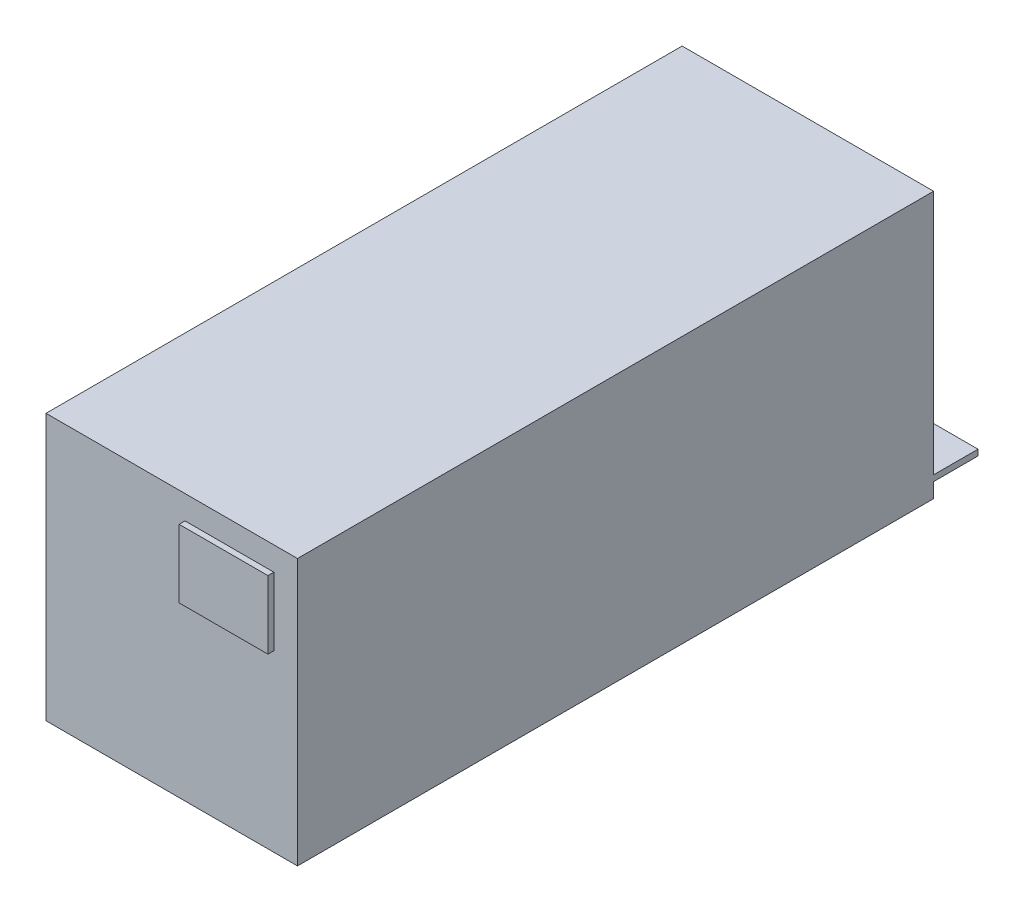
ISO-10303-21;
HEADER;
FILE_DESCRIPTION(('STEP AP214'),'2;1');
FILE_NAME('part.step','',(''),(''),'','','');
FILE_SCHEMA(('AUTOMOTIVE_DESIGN { 1 0 10303 214 1 1 1 1 }'));
ENDSEC;
DATA;
#1=APPLICATION_CONTEXT('core data for automotive mechanical design processes');
#2=APPLICATION_PROTOCOL_DEFINITION('international standard','automotive_design',2000,#1);
#3=PRODUCT_CONTEXT('',#1,'mechanical');
#4=PRODUCT('Part','Part','',(#3));
#5=PRODUCT_RELATED_PRODUCT_CATEGORY('part','',(#4));
#6=PRODUCT_DEFINITION_FORMATION('','',#4);
#7=PRODUCT_DEFINITION_CONTEXT('part definition',#1,'design');
#8=PRODUCT_DEFINITION('design','',#6,#7);
#9=PRODUCT_DEFINITION_SHAPE('','',#8);
#10=(LENGTH_UNIT() NAMED_UNIT(*) SI_UNIT(.MILLI.,.METRE.));
#11=(NAMED_UNIT(*) PLANE_ANGLE_UNIT() SI_UNIT($,.RADIAN.));
#12=(NAMED_UNIT(*) SI_UNIT($,.STERADIAN.) SOLID_ANGLE_UNIT());
#13=UNCERTAINTY_MEASURE_WITH_UNIT(LENGTH_MEASURE(1.E-05),#10,'distance_accuracy_value','');
#14=(GEOMETRIC_REPRESENTATION_CONTEXT(3) GLOBAL_UNCERTAINTY_ASSIGNED_CONTEXT((#13)) GLOBAL_UNIT_ASSIGNED_CONTEXT((#10,
#11,#12)) REPRESENTATION_CONTEXT('',''));
#15=CARTESIAN_POINT('',(0.,0.,0.));
#16=DIRECTION('',(0.,0.,1.));
#17=DIRECTION('',(1.,0.,0.));
#18=AXIS2_PLACEMENT_3D('',#15,#16,#17);
#19=CARTESIAN_POINT('',(0.,0.,215.));
#20=DIRECTION('',(0.,0.,-1.));
#21=DIRECTION('',(-1.,0.,0.));
#22=AXIS2_PLACEMENT_3D('',#19,#20,#21);
#23=PLANE('',#22);
#24=DIRECTION('',(0.,1.,0.));
#25=VECTOR('',#24,1.);
#26=CARTESIAN_POINT('',(42.5,-45.,215.));
#27=LINE('',#26,#25);
#28=CARTESIAN_POINT('',(42.5,-45.,215.));
#29=VERTEX_POINT('',#28);
#30=CARTESIAN_POINT('',(42.5,45.,215.));
#31=VERTEX_POINT('',#30);
#32=EDGE_CURVE('E197',#29,#31,#27,.T.);
#33=ORIENTED_EDGE('',*,*,#32,.T.);
#34=DIRECTION('',(-1.,0.,0.));
#35=VECTOR('',#34,1.);
#36=CARTESIAN_POINT('',(-42.5,45.,215.));
#37=LINE('',#36,#35);
#38=CARTESIAN_POINT('',(-42.5,45.,215.));
#39=VERTEX_POINT('',#38);
#40=EDGE_CURVE('E201',#31,#39,#37,.T.);
#41=ORIENTED_EDGE('',*,*,#40,.T.);
#42=DIRECTION('',(0.,-1.,0.));
#43=VECTOR('',#42,1.);
#44=CARTESIAN_POINT('',(-42.5,-45.,215.));
#45=LINE('',#44,#43);
#46=CARTESIAN_POINT('',(-42.5,-45.,215.));
#47=VERTEX_POINT('',#46);
#48=EDGE_CURVE('E205',#39,#47,#45,.T.);
#49=ORIENTED_EDGE('',*,*,#48,.T.);
#50=DIRECTION('',(1.,0.,0.));
#51=VECTOR('',#50,1.);
#52=CARTESIAN_POINT('',(-42.5,-45.,215.));
#53=LINE('',#52,#51);
#54=EDGE_CURVE('E208',#47,#29,#53,.T.);
#55=ORIENTED_EDGE('',*,*,#54,.T.);
#56=EDGE_LOOP('',(#33,#41,#49,#55));
#57=FACE_BOUND('',#56,.T.);
#58=DIRECTION('',(0.,-1.,0.));
#59=VECTOR('',#58,1.);
#60=CARTESIAN_POINT('',(4.50000000000001,14.,215.));
#61=LINE('',#60,#59);
#62=CARTESIAN_POINT('',(4.50000000000001,37.,215.));
#63=VERTEX_POINT('',#62);
#64=CARTESIAN_POINT('',(4.50000000000001,14.,215.));
#65=VERTEX_POINT('',#64);
#66=EDGE_CURVE('E151',#63,#65,#61,.T.);
#67=ORIENTED_EDGE('',*,*,#66,.F.);
#68=DIRECTION('',(-1.,0.,0.));
#69=VECTOR('',#68,1.);
#70=CARTESIAN_POINT('',(4.50000000000001,37.,215.));
#71=LINE('',#70,#69);
#72=CARTESIAN_POINT('',(34.5,37.,215.));
#73=VERTEX_POINT('',#72);
#74=EDGE_CURVE('E148',#73,#63,#71,.T.);
#75=ORIENTED_EDGE('',*,*,#74,.F.);
#76=DIRECTION('',(0.,1.,0.));
#77=VECTOR('',#76,1.);
#78=CARTESIAN_POINT('',(34.5,14.,215.));
#79=LINE('',#78,#77);
#80=CARTESIAN_POINT('',(34.5,14.,215.));
#81=VERTEX_POINT('',#80);
#82=EDGE_CURVE('E60',#81,#73,#79,.T.);
#83=ORIENTED_EDGE('',*,*,#82,.F.);
#84=DIRECTION('',(1.,0.,0.));
#85=VECTOR('',#84,1.);
#86=CARTESIAN_POINT('',(4.50000000000001,14.,215.));
#87=LINE('',#86,#85);
#88=EDGE_CURVE('E55',#65,#81,#87,.T.);
#89=ORIENTED_EDGE('',*,*,#88,.F.);
#90=EDGE_LOOP('',(#67,#75,#83,#89));
#91=FACE_BOUND('',#90,.T.);
#92=ADVANCED_FACE('F39',(#57,#91),#23,.F.);
#93=CARTESIAN_POINT('',(0.,0.,0.));
#94=DIRECTION('',(0.,0.,-1.));
#95=DIRECTION('',(-1.,0.,0.));
#96=AXIS2_PLACEMENT_3D('',#93,#94,#95);
#97=PLANE('',#96);
#98=DIRECTION('',(1.,0.,0.));
#99=VECTOR('',#98,1.);
#100=CARTESIAN_POINT('',(42.5,-38.,0.));
#101=LINE('',#100,#99);
#102=CARTESIAN_POINT('',(-42.5,-38.,0.));
#103=VERTEX_POINT('',#102);
#104=CARTESIAN_POINT('',(42.5,-38.,0.));
#105=VERTEX_POINT('',#104);
#106=EDGE_CURVE('E158',#103,#105,#101,.T.);
#107=ORIENTED_EDGE('',*,*,#106,.F.);
#108=DIRECTION('',(0.,-1.,0.));
#109=VECTOR('',#108,1.);
#110=CARTESIAN_POINT('',(-42.5,-45.,0.));
#111=LINE('',#110,#109);
#112=CARTESIAN_POINT('',(-42.5,45.,0.));
#113=VERTEX_POINT('',#112);
#114=EDGE_CURVE('E220',#113,#103,#111,.T.);
#115=ORIENTED_EDGE('',*,*,#114,.F.);
#116=DIRECTION('',(-1.,0.,0.));
#117=VECTOR('',#116,1.);
#118=CARTESIAN_POINT('',(-42.5,45.,0.));
#119=LINE('',#118,#117);
#120=CARTESIAN_POINT('',(42.5,45.,0.));
#121=VERTEX_POINT('',#120);
#122=EDGE_CURVE('E216',#121,#113,#119,.T.);
#123=ORIENTED_EDGE('',*,*,#122,.F.);
#124=DIRECTION('',(0.,1.,0.));
#125=VECTOR('',#124,1.);
#126=CARTESIAN_POINT('',(42.5,-45.,0.));
#127=LINE('',#126,#125);
#128=EDGE_CURVE('E196',#105,#121,#127,.T.);
#129=ORIENTED_EDGE('',*,*,#128,.F.);
#130=EDGE_LOOP('',(#107,#115,#123,#129));
#131=FACE_BOUND('',#130,.T.);
#132=ADVANCED_FACE('F244',(#131),#97,.T.);
#133=CARTESIAN_POINT('',(42.5,-45.,215.));
#134=DIRECTION('',(-1.,0.,0.));
#135=DIRECTION('',(0.,0.,1.));
#136=AXIS2_PLACEMENT_3D('',#133,#134,#135);
#137=PLANE('',#136);
#138=CARTESIAN_POINT('',(42.5,-45.,0.));
#139=VERTEX_POINT('',#138);
#140=CARTESIAN_POINT('',(42.5,-40.,0.));
#141=VERTEX_POINT('',#140);
#142=EDGE_CURVE('E212',#139,#141,#127,.T.);
#143=ORIENTED_EDGE('',*,*,#142,.T.);
#144=DIRECTION('',(0.,0.,1.));
#145=VECTOR('',#144,1.);
#146=CARTESIAN_POINT('',(42.5,-40.,-15.));
#147=LINE('',#146,#145);
#148=CARTESIAN_POINT('',(42.5,-40.,-15.));
#149=VERTEX_POINT('',#148);
#150=EDGE_CURVE('E192',#149,#141,#147,.T.);
#151=ORIENTED_EDGE('',*,*,#150,.F.);
#152=DIRECTION('',(0.,-1.,0.));
#153=VECTOR('',#152,1.);
#154=CARTESIAN_POINT('',(42.5,-40.,-15.));
#155=LINE('',#154,#153);
#156=CARTESIAN_POINT('',(42.5,-38.,-15.));
#157=VERTEX_POINT('',#156);
#158=EDGE_CURVE('E164',#157,#149,#155,.T.);
#159=ORIENTED_EDGE('',*,*,#158,.F.);
#160=DIRECTION('',(0.,0.,1.));
#161=VECTOR('',#160,1.);
#162=CARTESIAN_POINT('',(42.5,-38.,-15.));
#163=LINE('',#162,#161);
#164=EDGE_CURVE('E176',#157,#105,#163,.T.);
#165=ORIENTED_EDGE('',*,*,#164,.T.);
#166=ORIENTED_EDGE('',*,*,#128,.T.);
#167=DIRECTION('',(0.,0.,-1.));
#168=VECTOR('',#167,1.);
#169=CARTESIAN_POINT('',(42.5,45.,215.));
#170=LINE('',#169,#168);
#171=EDGE_CURVE('E11',#31,#121,#170,.T.);
#172=ORIENTED_EDGE('',*,*,#171,.F.);
#173=ORIENTED_EDGE('',*,*,#32,.F.);
#174=DIRECTION('',(0.,0.,-1.));
#175=VECTOR('',#174,1.);
#176=CARTESIAN_POINT('',(42.5,-45.,215.));
#177=LINE('',#176,#175);
#178=EDGE_CURVE('E211',#29,#139,#177,.T.);
#179=ORIENTED_EDGE('',*,*,#178,.T.);
#180=EDGE_LOOP('',(#143,#151,#159,#165,#166,#172,#173,#179));
#181=FACE_BOUND('',#180,.T.);
#182=ADVANCED_FACE('F41',(#181),#137,.F.);
#183=CARTESIAN_POINT('',(-42.5,45.,215.));
#184=DIRECTION('',(0.,-1.,0.));
#185=DIRECTION('',(0.,0.,-1.));
#186=AXIS2_PLACEMENT_3D('',#183,#184,#185);
#187=PLANE('',#186);
#188=ORIENTED_EDGE('',*,*,#122,.T.);
#189=DIRECTION('',(0.,0.,-1.));
#190=VECTOR('',#189,1.);
#191=CARTESIAN_POINT('',(-42.5,45.,215.));
#192=LINE('',#191,#190);
#193=EDGE_CURVE('E48',#39,#113,#192,.T.);
#194=ORIENTED_EDGE('',*,*,#193,.F.);
#195=ORIENTED_EDGE('',*,*,#40,.F.);
#196=ORIENTED_EDGE('',*,*,#171,.T.);
#197=EDGE_LOOP('',(#188,#194,#195,#196));
#198=FACE_BOUND('',#197,.T.);
#199=ADVANCED_FACE('F269',(#198),#187,.F.);
#200=CARTESIAN_POINT('',(-42.5,-45.,215.));
#201=DIRECTION('',(1.,0.,0.));
#202=DIRECTION('',(0.,0.,-1.));
#203=AXIS2_PLACEMENT_3D('',#200,#201,#202);
#204=PLANE('',#203);
#205=ORIENTED_EDGE('',*,*,#114,.T.);
#206=DIRECTION('',(0.,0.,1.));
#207=VECTOR('',#206,1.);
#208=CARTESIAN_POINT('',(-42.5,-38.,-15.));
#209=LINE('',#208,#207);
#210=CARTESIAN_POINT('',(-42.5,-38.,-15.));
#211=VERTEX_POINT('',#210);
#212=EDGE_CURVE('E184',#211,#103,#209,.T.);
#213=ORIENTED_EDGE('',*,*,#212,.F.);
#214=DIRECTION('',(0.,1.,0.));
#215=VECTOR('',#214,1.);
#216=CARTESIAN_POINT('',(-42.5,-40.,-15.));
#217=LINE('',#216,#215);
#218=CARTESIAN_POINT('',(-42.5,-40.,-15.));
#219=VERTEX_POINT('',#218);
#220=EDGE_CURVE('E171',#219,#211,#217,.T.);
#221=ORIENTED_EDGE('',*,*,#220,.F.);
#222=DIRECTION('',(0.,0.,1.));
#223=VECTOR('',#222,1.);
#224=CARTESIAN_POINT('',(-42.5,-40.,-15.));
#225=LINE('',#224,#223);
#226=CARTESIAN_POINT('',(-42.5,-40.,0.));
#227=VERTEX_POINT('',#226);
#228=EDGE_CURVE('E188',#219,#227,#225,.T.);
#229=ORIENTED_EDGE('',*,*,#228,.T.);
#230=CARTESIAN_POINT('',(-42.5,-45.,0.));
#231=VERTEX_POINT('',#230);
#232=EDGE_CURVE('E219',#227,#231,#111,.T.);
#233=ORIENTED_EDGE('',*,*,#232,.T.);
#234=DIRECTION('',(0.,0.,-1.));
#235=VECTOR('',#234,1.);
#236=CARTESIAN_POINT('',(-42.5,-45.,215.));
#237=LINE('',#236,#235);
#238=EDGE_CURVE('E229',#47,#231,#237,.T.);
#239=ORIENTED_EDGE('',*,*,#238,.F.);
#240=ORIENTED_EDGE('',*,*,#48,.F.);
#241=ORIENTED_EDGE('',*,*,#193,.T.);
#242=EDGE_LOOP('',(#205,#213,#221,#229,#233,#239,#240,#241));
#243=FACE_BOUND('',#242,.T.);
#244=ADVANCED_FACE('F238',(#243),#204,.F.);
#245=CARTESIAN_POINT('',(-42.5,-45.,215.));
#246=DIRECTION('',(0.,1.,0.));
#247=DIRECTION('',(0.,0.,1.));
#248=AXIS2_PLACEMENT_3D('',#245,#246,#247);
#249=PLANE('',#248);
#250=DIRECTION('',(1.,0.,0.));
#251=VECTOR('',#250,1.);
#252=CARTESIAN_POINT('',(-42.5,-45.,0.));
#253=LINE('',#252,#251);
#254=EDGE_CURVE('E202',#231,#139,#253,.T.);
#255=ORIENTED_EDGE('',*,*,#254,.T.);
#256=ORIENTED_EDGE('',*,*,#178,.F.);
#257=ORIENTED_EDGE('',*,*,#54,.F.);
#258=ORIENTED_EDGE('',*,*,#238,.T.);
#259=EDGE_LOOP('',(#255,#256,#257,#258));
#260=FACE_BOUND('',#259,.T.);
#261=ADVANCED_FACE('F267',(#260),#249,.F.);
#262=DIRECTION('',(-1.,0.,0.));
#263=VECTOR('',#262,1.);
#264=CARTESIAN_POINT('',(42.5,-40.,0.));
#265=LINE('',#264,#263);
#266=EDGE_CURVE('E153',#141,#227,#265,.T.);
#267=ORIENTED_EDGE('',*,*,#266,.F.);
#268=ORIENTED_EDGE('',*,*,#142,.F.);
#269=ORIENTED_EDGE('',*,*,#254,.F.);
#270=ORIENTED_EDGE('',*,*,#232,.F.);
#271=EDGE_LOOP('',(#267,#268,#269,#270));
#272=FACE_BOUND('',#271,.T.);
#273=ADVANCED_FACE('F261',(#272),#97,.T.);
#274=CARTESIAN_POINT('',(42.5,-40.,-15.));
#275=DIRECTION('',(0.,1.,0.));
#276=DIRECTION('',(0.,0.,1.));
#277=AXIS2_PLACEMENT_3D('',#274,#275,#276);
#278=PLANE('',#277);
#279=ORIENTED_EDGE('',*,*,#266,.T.);
#280=ORIENTED_EDGE('',*,*,#228,.F.);
#281=DIRECTION('',(-1.,0.,0.));
#282=VECTOR('',#281,1.);
#283=CARTESIAN_POINT('',(42.5,-40.,-15.));
#284=LINE('',#283,#282);
#285=EDGE_CURVE('E168',#149,#219,#284,.T.);
#286=ORIENTED_EDGE('',*,*,#285,.F.);
#287=ORIENTED_EDGE('',*,*,#150,.T.);
#288=EDGE_LOOP('',(#279,#280,#286,#287));
#289=FACE_BOUND('',#288,.T.);
#290=ADVANCED_FACE('F258',(#289),#278,.F.);
#291=CARTESIAN_POINT('',(42.5,-38.,-15.));
#292=DIRECTION('',(0.,-1.,0.));
#293=DIRECTION('',(1.,0.,0.));
#294=AXIS2_PLACEMENT_3D('',#291,#292,#293);
#295=PLANE('',#294);
#296=ORIENTED_EDGE('',*,*,#106,.T.);
#297=ORIENTED_EDGE('',*,*,#164,.F.);
#298=DIRECTION('',(1.,0.,0.));
#299=VECTOR('',#298,1.);
#300=CARTESIAN_POINT('',(42.5,-38.,-15.));
#301=LINE('',#300,#299);
#302=EDGE_CURVE('E174',#211,#157,#301,.T.);
#303=ORIENTED_EDGE('',*,*,#302,.F.);
#304=ORIENTED_EDGE('',*,*,#212,.T.);
#305=EDGE_LOOP('',(#296,#297,#303,#304));
#306=FACE_BOUND('',#305,.T.);
#307=ADVANCED_FACE('F247',(#306),#295,.F.);
#308=CARTESIAN_POINT('',(0.,0.,-15.));
#309=DIRECTION('',(0.,0.,1.));
#310=DIRECTION('',(1.,0.,0.));
#311=AXIS2_PLACEMENT_3D('',#308,#309,#310);
#312=PLANE('',#311);
#313=ORIENTED_EDGE('',*,*,#158,.T.);
#314=ORIENTED_EDGE('',*,*,#285,.T.);
#315=ORIENTED_EDGE('',*,*,#220,.T.);
#316=ORIENTED_EDGE('',*,*,#302,.T.);
#317=EDGE_LOOP('',(#313,#314,#315,#316));
#318=FACE_BOUND('',#317,.T.);
#319=ADVANCED_FACE('F254',(#318),#312,.F.);
#320=CARTESIAN_POINT('',(4.50000000000001,14.,217.));
#321=DIRECTION('',(1.,0.,0.));
#322=DIRECTION('',(0.,0.,-1.));
#323=AXIS2_PLACEMENT_3D('',#320,#321,#322);
#324=PLANE('',#323);
#325=ORIENTED_EDGE('',*,*,#66,.T.);
#326=DIRECTION('',(0.,0.,-1.));
#327=VECTOR('',#326,1.);
#328=CARTESIAN_POINT('',(4.50000000000001,14.,217.));
#329=LINE('',#328,#327);
#330=CARTESIAN_POINT('',(4.50000000000001,14.,217.));
#331=VERTEX_POINT('',#330);
#332=EDGE_CURVE('E130',#331,#65,#329,.T.);
#333=ORIENTED_EDGE('',*,*,#332,.F.);
#334=DIRECTION('',(0.,-1.,0.));
#335=VECTOR('',#334,1.);
#336=CARTESIAN_POINT('',(4.50000000000001,14.,217.));
#337=LINE('',#336,#335);
#338=CARTESIAN_POINT('',(4.50000000000001,37.,217.));
#339=VERTEX_POINT('',#338);
#340=EDGE_CURVE('E138',#339,#331,#337,.T.);
#341=ORIENTED_EDGE('',*,*,#340,.F.);
#342=DIRECTION('',(0.,0.,-1.));
#343=VECTOR('',#342,1.);
#344=CARTESIAN_POINT('',(4.50000000000001,37.,217.));
#345=LINE('',#344,#343);
#346=EDGE_CURVE('E399',#339,#63,#345,.T.);
#347=ORIENTED_EDGE('',*,*,#346,.T.);
#348=EDGE_LOOP('',(#325,#333,#341,#347));
#349=FACE_BOUND('',#348,.T.);
#350=ADVANCED_FACE('F150',(#349),#324,.F.);
#351=CARTESIAN_POINT('',(4.50000000000001,14.,217.));
#352=DIRECTION('',(0.,1.,0.));
#353=DIRECTION('',(0.,0.,1.));
#354=AXIS2_PLACEMENT_3D('',#351,#352,#353);
#355=PLANE('',#354);
#356=ORIENTED_EDGE('',*,*,#88,.T.);
#357=DIRECTION('',(0.,0.,-1.));
#358=VECTOR('',#357,1.);
#359=CARTESIAN_POINT('',(34.5,14.,217.));
#360=LINE('',#359,#358);
#361=CARTESIAN_POINT('',(34.5,14.,217.));
#362=VERTEX_POINT('',#361);
#363=EDGE_CURVE('E133',#362,#81,#360,.T.);
#364=ORIENTED_EDGE('',*,*,#363,.F.);
#365=DIRECTION('',(1.,0.,0.));
#366=VECTOR('',#365,1.);
#367=CARTESIAN_POINT('',(4.50000000000001,14.,217.));
#368=LINE('',#367,#366);
#369=EDGE_CURVE('E126',#331,#362,#368,.T.);
#370=ORIENTED_EDGE('',*,*,#369,.F.);
#371=ORIENTED_EDGE('',*,*,#332,.T.);
#372=EDGE_LOOP('',(#356,#364,#370,#371));
#373=FACE_BOUND('',#372,.T.);
#374=ADVANCED_FACE('F128',(#373),#355,.F.);
#375=CARTESIAN_POINT('',(34.5,14.,217.));
#376=DIRECTION('',(-1.,0.,0.));
#377=DIRECTION('',(0.,0.,1.));
#378=AXIS2_PLACEMENT_3D('',#375,#376,#377);
#379=PLANE('',#378);
#380=ORIENTED_EDGE('',*,*,#82,.T.);
#381=DIRECTION('',(0.,0.,-1.));
#382=VECTOR('',#381,1.);
#383=CARTESIAN_POINT('',(34.5,37.,217.));
#384=LINE('',#383,#382);
#385=CARTESIAN_POINT('',(34.5,37.,217.));
#386=VERTEX_POINT('',#385);
#387=EDGE_CURVE('E160',#386,#73,#384,.T.);
#388=ORIENTED_EDGE('',*,*,#387,.F.);
#389=DIRECTION('',(0.,1.,0.));
#390=VECTOR('',#389,1.);
#391=CARTESIAN_POINT('',(34.5,14.,217.));
#392=LINE('',#391,#390);
#393=EDGE_CURVE('E137',#362,#386,#392,.T.);
#394=ORIENTED_EDGE('',*,*,#393,.F.);
#395=ORIENTED_EDGE('',*,*,#363,.T.);
#396=EDGE_LOOP('',(#380,#388,#394,#395));
#397=FACE_BOUND('',#396,.T.);
#398=ADVANCED_FACE('F324',(#397),#379,.F.);
#399=CARTESIAN_POINT('',(4.50000000000001,37.,217.));
#400=DIRECTION('',(0.,-1.,0.));
#401=DIRECTION('',(0.,0.,-1.));
#402=AXIS2_PLACEMENT_3D('',#399,#400,#401);
#403=PLANE('',#402);
#404=ORIENTED_EDGE('',*,*,#74,.T.);
#405=ORIENTED_EDGE('',*,*,#346,.F.);
#406=DIRECTION('',(-1.,0.,0.));
#407=VECTOR('',#406,1.);
#408=CARTESIAN_POINT('',(4.50000000000001,37.,217.));
#409=LINE('',#408,#407);
#410=EDGE_CURVE('E143',#386,#339,#409,.T.);
#411=ORIENTED_EDGE('',*,*,#410,.F.);
#412=ORIENTED_EDGE('',*,*,#387,.T.);
#413=EDGE_LOOP('',(#404,#405,#411,#412));
#414=FACE_BOUND('',#413,.T.);
#415=ADVANCED_FACE('F331',(#414),#403,.F.);
#416=CARTESIAN_POINT('',(0.,0.,217.));
#417=DIRECTION('',(0.,0.,-1.));
#418=DIRECTION('',(-1.,0.,0.));
#419=AXIS2_PLACEMENT_3D('',#416,#417,#418);
#420=PLANE('',#419);
#421=ORIENTED_EDGE('',*,*,#340,.T.);
#422=ORIENTED_EDGE('',*,*,#369,.T.);
#423=ORIENTED_EDGE('',*,*,#393,.T.);
#424=ORIENTED_EDGE('',*,*,#410,.T.);
#425=EDGE_LOOP('',(#421,#422,#423,#424));
#426=FACE_BOUND('',#425,.T.);
#427=ADVANCED_FACE('F141',(#426),#420,.F.);
#428=CLOSED_SHELL('',(#92,#132,#182,#199,#244,#261,#273,#290,#307,#319,#350,#374,#398,#415,#427));
#429=MANIFOLD_SOLID_BREP('B2',#428);
#430=ADVANCED_BREP_SHAPE_REPRESENTATION('',(#18,#429),#14);
#431=SHAPE_DEFINITION_REPRESENTATION(#9,#430);
ENDSEC;
END-ISO-10303-21;
